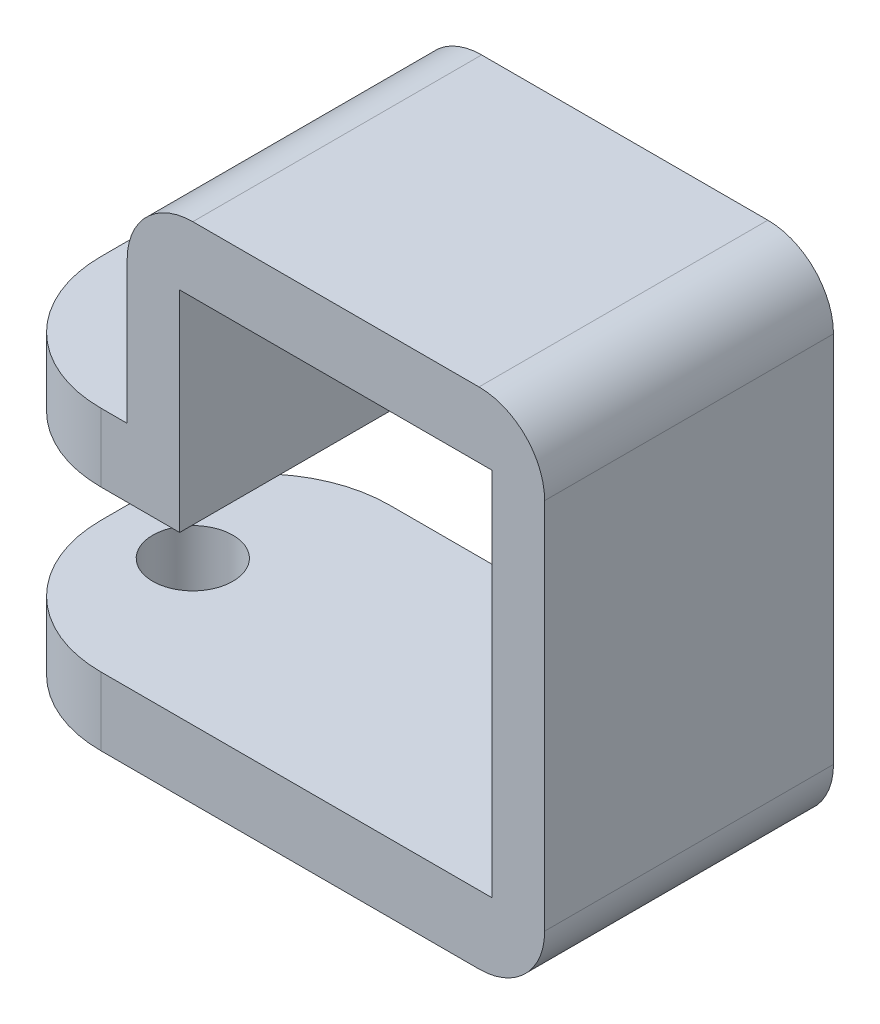
ISO-10303-21;
HEADER;
FILE_DESCRIPTION(('STEP AP214'),'2;1');
FILE_NAME('part.step','',(''),(''),'','','');
FILE_SCHEMA(('AUTOMOTIVE_DESIGN { 1 0 10303 214 1 1 1 1 }'));
ENDSEC;
DATA;
#1=APPLICATION_CONTEXT('core data for automotive mechanical design processes');
#2=APPLICATION_PROTOCOL_DEFINITION('international standard','automotive_design',2000,#1);
#3=PRODUCT_CONTEXT('',#1,'mechanical');
#4=PRODUCT('Part','Part','',(#3));
#5=PRODUCT_RELATED_PRODUCT_CATEGORY('part','',(#4));
#6=PRODUCT_DEFINITION_FORMATION('','',#4);
#7=PRODUCT_DEFINITION_CONTEXT('part definition',#1,'design');
#8=PRODUCT_DEFINITION('design','',#6,#7);
#9=PRODUCT_DEFINITION_SHAPE('','',#8);
#10=(LENGTH_UNIT() NAMED_UNIT(*) SI_UNIT(.MILLI.,.METRE.));
#11=(NAMED_UNIT(*) PLANE_ANGLE_UNIT() SI_UNIT($,.RADIAN.));
#12=(NAMED_UNIT(*) SI_UNIT($,.STERADIAN.) SOLID_ANGLE_UNIT());
#13=UNCERTAINTY_MEASURE_WITH_UNIT(LENGTH_MEASURE(1.E-05),#10,'distance_accuracy_value','');
#14=(GEOMETRIC_REPRESENTATION_CONTEXT(3) GLOBAL_UNCERTAINTY_ASSIGNED_CONTEXT((#13)) GLOBAL_UNIT_ASSIGNED_CONTEXT((#10,
#11,#12)) REPRESENTATION_CONTEXT('',''));
#15=CARTESIAN_POINT('',(0.,0.,0.));
#16=DIRECTION('',(0.,0.,1.));
#17=DIRECTION('',(1.,0.,0.));
#18=AXIS2_PLACEMENT_3D('',#15,#16,#17);
#19=CARTESIAN_POINT('',(-5.95,0.,11.));
#20=DIRECTION('',(-1.,0.,0.));
#21=DIRECTION('',(0.,0.,1.));
#22=AXIS2_PLACEMENT_3D('',#19,#20,#21);
#23=PLANE('',#22);
#24=DIRECTION('',(0.,1.,0.));
#25=VECTOR('',#24,1.);
#26=CARTESIAN_POINT('',(-5.95,0.,0.));
#27=LINE('',#26,#25);
#28=CARTESIAN_POINT('',(-5.95,0.,0.));
#29=VERTEX_POINT('',#28);
#30=CARTESIAN_POINT('',(-5.95,8.,0.));
#31=VERTEX_POINT('',#30);
#32=EDGE_CURVE('E297',#29,#31,#27,.T.);
#33=ORIENTED_EDGE('',*,*,#32,.T.);
#34=DIRECTION('',(0.,0.,-1.));
#35=VECTOR('',#34,1.);
#36=CARTESIAN_POINT('',(-5.95,8.,11.));
#37=LINE('',#36,#35);
#38=CARTESIAN_POINT('',(-5.95,8.,11.));
#39=VERTEX_POINT('',#38);
#40=EDGE_CURVE('E190',#39,#31,#37,.T.);
#41=ORIENTED_EDGE('',*,*,#40,.F.);
#42=DIRECTION('',(0.,1.,0.));
#43=VECTOR('',#42,1.);
#44=CARTESIAN_POINT('',(-5.95,0.,11.));
#45=LINE('',#44,#43);
#46=CARTESIAN_POINT('',(-5.95,0.,11.));
#47=VERTEX_POINT('',#46);
#48=EDGE_CURVE('E172',#47,#39,#45,.T.);
#49=ORIENTED_EDGE('',*,*,#48,.F.);
#50=DIRECTION('',(0.,0.,-1.));
#51=VECTOR('',#50,1.);
#52=CARTESIAN_POINT('',(-5.95,0.,11.));
#53=LINE('',#52,#51);
#54=EDGE_CURVE('E184',#47,#29,#53,.T.);
#55=ORIENTED_EDGE('',*,*,#54,.T.);
#56=EDGE_LOOP('',(#33,#41,#49,#55));
#57=FACE_BOUND('',#56,.T.);
#58=ADVANCED_FACE('F39',(#57),#23,.F.);
#59=CARTESIAN_POINT('',(-5.95,8.,11.));
#60=DIRECTION('',(0.,1.,0.));
#61=DIRECTION('',(0.,0.,1.));
#62=AXIS2_PLACEMENT_3D('',#59,#60,#61);
#63=PLANE('',#62);
#64=DIRECTION('',(1.,0.,0.));
#65=VECTOR('',#64,1.);
#66=CARTESIAN_POINT('',(-5.95,8.,0.));
#67=LINE('',#66,#65);
#68=CARTESIAN_POINT('',(5.95,8.,0.));
#69=VERTEX_POINT('',#68);
#70=EDGE_CURVE('E296',#31,#69,#67,.T.);
#71=ORIENTED_EDGE('',*,*,#70,.T.);
#72=DIRECTION('',(0.,0.,-1.));
#73=VECTOR('',#72,1.);
#74=CARTESIAN_POINT('',(5.95,8.,11.));
#75=LINE('',#74,#73);
#76=CARTESIAN_POINT('',(5.95,8.,11.));
#77=VERTEX_POINT('',#76);
#78=EDGE_CURVE('E196',#77,#69,#75,.T.);
#79=ORIENTED_EDGE('',*,*,#78,.F.);
#80=DIRECTION('',(1.,0.,0.));
#81=VECTOR('',#80,1.);
#82=CARTESIAN_POINT('',(-5.95,8.,11.));
#83=LINE('',#82,#81);
#84=EDGE_CURVE('E186',#39,#77,#83,.T.);
#85=ORIENTED_EDGE('',*,*,#84,.F.);
#86=ORIENTED_EDGE('',*,*,#40,.T.);
#87=EDGE_LOOP('',(#71,#79,#85,#86));
#88=FACE_BOUND('',#87,.T.);
#89=ADVANCED_FACE('F298',(#88),#63,.F.);
#90=CARTESIAN_POINT('',(5.95,0.,11.));
#91=DIRECTION('',(1.,0.,0.));
#92=DIRECTION('',(0.,1.,0.));
#93=AXIS2_PLACEMENT_3D('',#90,#91,#92);
#94=PLANE('',#93);
#95=DIRECTION('',(0.,-1.,0.));
#96=VECTOR('',#95,1.);
#97=CARTESIAN_POINT('',(5.95,0.,0.));
#98=LINE('',#97,#96);
#99=CARTESIAN_POINT('',(5.95,-6.09999999999999,0.));
#100=VERTEX_POINT('',#99);
#101=EDGE_CURVE('E292',#69,#100,#98,.T.);
#102=ORIENTED_EDGE('',*,*,#101,.T.);
#103=DIRECTION('',(0.,0.,-1.));
#104=VECTOR('',#103,1.);
#105=CARTESIAN_POINT('',(5.95,-6.09999999999999,11.));
#106=LINE('',#105,#104);
#107=CARTESIAN_POINT('',(5.95,-6.09999999999999,11.));
#108=VERTEX_POINT('',#107);
#109=EDGE_CURVE('E284',#108,#100,#106,.T.);
#110=ORIENTED_EDGE('',*,*,#109,.F.);
#111=DIRECTION('',(0.,-1.,0.));
#112=VECTOR('',#111,1.);
#113=CARTESIAN_POINT('',(5.95,0.,11.));
#114=LINE('',#113,#112);
#115=EDGE_CURVE('E291',#77,#108,#114,.T.);
#116=ORIENTED_EDGE('',*,*,#115,.F.);
#117=ORIENTED_EDGE('',*,*,#78,.T.);
#118=EDGE_LOOP('',(#102,#110,#116,#117));
#119=FACE_BOUND('',#118,.T.);
#120=ADVANCED_FACE('F287',(#119),#94,.F.);
#121=CARTESIAN_POINT('',(5.95,-6.09999999999999,11.));
#122=DIRECTION('',(0.,-1.,0.));
#123=DIRECTION('',(0.,0.,-1.));
#124=AXIS2_PLACEMENT_3D('',#121,#122,#123);
#125=PLANE('',#124);
#126=CARTESIAN_POINT('',(-10.95,-6.09999999999999,5.5));
#127=DIRECTION('',(0.,-1.,0.));
#128=DIRECTION('',(0.,0.,-1.));
#129=AXIS2_PLACEMENT_3D('',#126,#127,#128);
#130=CIRCLE('',#129,1.525);
#131=CARTESIAN_POINT('',(-10.95,-6.09999999999999,3.975));
#132=VERTEX_POINT('',#131);
#133=EDGE_CURVE('E235',#132,#132,#130,.T.);
#134=ORIENTED_EDGE('',*,*,#133,.T.);
#135=EDGE_LOOP('',(#134));
#136=FACE_BOUND('',#135,.T.);
#137=DIRECTION('',(-1.,0.,0.));
#138=VECTOR('',#137,1.);
#139=CARTESIAN_POINT('',(5.95,-6.09999999999999,0.));
#140=LINE('',#139,#138);
#141=CARTESIAN_POINT('',(-8.95,-6.09999999999999,0.));
#142=VERTEX_POINT('',#141);
#143=EDGE_CURVE('E305',#100,#142,#140,.T.);
#144=ORIENTED_EDGE('',*,*,#143,.T.);
#145=CARTESIAN_POINT('',(-8.95,-6.09999999999999,5.));
#146=DIRECTION('',(0.,-1.,0.));
#147=DIRECTION('',(0.,0.,-1.));
#148=AXIS2_PLACEMENT_3D('',#145,#146,#147);
#149=CIRCLE('',#148,5.);
#150=CARTESIAN_POINT('',(-13.95,-6.09999999999999,5.));
#151=VERTEX_POINT('',#150);
#152=EDGE_CURVE('E247',#142,#151,#149,.F.);
#153=ORIENTED_EDGE('',*,*,#152,.T.);
#154=DIRECTION('',(0.,0.,-1.));
#155=VECTOR('',#154,1.);
#156=CARTESIAN_POINT('',(-13.95,-6.09999999999999,11.));
#157=LINE('',#156,#155);
#158=CARTESIAN_POINT('',(-13.95,-6.09999999999999,6.));
#159=VERTEX_POINT('',#158);
#160=EDGE_CURVE('E283',#159,#151,#157,.T.);
#161=ORIENTED_EDGE('',*,*,#160,.F.);
#162=CARTESIAN_POINT('',(-8.95,-6.09999999999999,6.));
#163=DIRECTION('',(0.,-1.,0.));
#164=DIRECTION('',(0.,0.,-1.));
#165=AXIS2_PLACEMENT_3D('',#162,#163,#164);
#166=CIRCLE('',#165,5.);
#167=CARTESIAN_POINT('',(-8.95,-6.09999999999999,11.));
#168=VERTEX_POINT('',#167);
#169=EDGE_CURVE('E246',#159,#168,#166,.F.);
#170=ORIENTED_EDGE('',*,*,#169,.T.);
#171=DIRECTION('',(-1.,0.,0.));
#172=VECTOR('',#171,1.);
#173=CARTESIAN_POINT('',(5.95,-6.09999999999999,11.));
#174=LINE('',#173,#172);
#175=EDGE_CURVE('E413',#108,#168,#174,.T.);
#176=ORIENTED_EDGE('',*,*,#175,.F.);
#177=ORIENTED_EDGE('',*,*,#109,.T.);
#178=EDGE_LOOP('',(#144,#153,#161,#170,#176,#177));
#179=FACE_BOUND('',#178,.T.);
#180=ADVANCED_FACE('F409',(#136,#179),#125,.F.);
#181=CARTESIAN_POINT('',(-13.95,-6.09999999999999,11.));
#182=DIRECTION('',(1.,0.,0.));
#183=DIRECTION('',(0.,0.,-1.));
#184=AXIS2_PLACEMENT_3D('',#181,#182,#183);
#185=PLANE('',#184);
#186=ORIENTED_EDGE('',*,*,#160,.T.);
#187=DIRECTION('',(0.,-1.,0.));
#188=VECTOR('',#187,1.);
#189=CARTESIAN_POINT('',(-13.95,-6.09999999999999,5.));
#190=LINE('',#189,#188);
#191=CARTESIAN_POINT('',(-13.95,-8.69999999999999,5.));
#192=VERTEX_POINT('',#191);
#193=EDGE_CURVE('E232',#151,#192,#190,.T.);
#194=ORIENTED_EDGE('',*,*,#193,.T.);
#195=DIRECTION('',(0.,0.,-1.));
#196=VECTOR('',#195,1.);
#197=CARTESIAN_POINT('',(-13.95,-8.69999999999999,11.));
#198=LINE('',#197,#196);
#199=CARTESIAN_POINT('',(-13.95,-8.69999999999999,6.));
#200=VERTEX_POINT('',#199);
#201=EDGE_CURVE('E279',#200,#192,#198,.T.);
#202=ORIENTED_EDGE('',*,*,#201,.F.);
#203=DIRECTION('',(0.,-1.,0.));
#204=VECTOR('',#203,1.);
#205=CARTESIAN_POINT('',(-13.95,-6.09999999999999,6.));
#206=LINE('',#205,#204);
#207=EDGE_CURVE('E226',#200,#159,#206,.F.);
#208=ORIENTED_EDGE('',*,*,#207,.T.);
#209=EDGE_LOOP('',(#186,#194,#202,#208));
#210=FACE_BOUND('',#209,.T.);
#211=ADVANCED_FACE('F401',(#210),#185,.F.);
#212=CARTESIAN_POINT('',(-13.95,-8.69999999999999,11.));
#213=DIRECTION('',(0.,1.,0.));
#214=DIRECTION('',(0.,0.,1.));
#215=AXIS2_PLACEMENT_3D('',#212,#213,#214);
#216=PLANE('',#215);
#217=CARTESIAN_POINT('',(-10.95,-8.7,5.5));
#218=DIRECTION('',(0.,1.,0.));
#219=DIRECTION('',(-1.,0.,0.));
#220=AXIS2_PLACEMENT_3D('',#217,#218,#219);
#221=CIRCLE('',#220,1.525);
#222=CARTESIAN_POINT('',(-12.475,-8.7,5.5));
#223=VERTEX_POINT('',#222);
#224=EDGE_CURVE('E231',#223,#223,#221,.T.);
#225=ORIENTED_EDGE('',*,*,#224,.T.);
#226=EDGE_LOOP('',(#225));
#227=FACE_BOUND('',#226,.T.);
#228=ORIENTED_EDGE('',*,*,#201,.T.);
#229=CARTESIAN_POINT('',(-8.95,-8.69999999999999,5.));
#230=DIRECTION('',(0.,1.,0.));
#231=DIRECTION('',(0.,0.,1.));
#232=AXIS2_PLACEMENT_3D('',#229,#230,#231);
#233=CIRCLE('',#232,5.);
#234=CARTESIAN_POINT('',(-8.95,-8.69999999999999,0.));
#235=VERTEX_POINT('',#234);
#236=EDGE_CURVE('E239',#192,#235,#233,.F.);
#237=ORIENTED_EDGE('',*,*,#236,.T.);
#238=DIRECTION('',(1.,0.,0.));
#239=VECTOR('',#238,1.);
#240=CARTESIAN_POINT('',(-13.95,-8.69999999999999,0.));
#241=LINE('',#240,#239);
#242=CARTESIAN_POINT('',(5.45,-8.69999999999999,0.));
#243=VERTEX_POINT('',#242);
#244=EDGE_CURVE('E308',#235,#243,#241,.T.);
#245=ORIENTED_EDGE('',*,*,#244,.T.);
#246=DIRECTION('',(0.,0.,-1.));
#247=VECTOR('',#246,1.);
#248=CARTESIAN_POINT('',(5.45,-8.69999999999999,11.));
#249=LINE('',#248,#247);
#250=CARTESIAN_POINT('',(5.45,-8.69999999999999,11.));
#251=VERTEX_POINT('',#250);
#252=EDGE_CURVE('E212',#243,#251,#249,.F.);
#253=ORIENTED_EDGE('',*,*,#252,.T.);
#254=DIRECTION('',(1.,0.,0.));
#255=VECTOR('',#254,1.);
#256=CARTESIAN_POINT('',(-13.95,-8.69999999999999,11.));
#257=LINE('',#256,#255);
#258=CARTESIAN_POINT('',(-8.95,-8.69999999999999,11.));
#259=VERTEX_POINT('',#258);
#260=EDGE_CURVE('E400',#259,#251,#257,.T.);
#261=ORIENTED_EDGE('',*,*,#260,.F.);
#262=CARTESIAN_POINT('',(-8.95,-8.69999999999999,6.));
#263=DIRECTION('',(0.,1.,0.));
#264=DIRECTION('',(0.,0.,1.));
#265=AXIS2_PLACEMENT_3D('',#262,#263,#264);
#266=CIRCLE('',#265,5.);
#267=EDGE_CURVE('E238',#259,#200,#266,.F.);
#268=ORIENTED_EDGE('',*,*,#267,.T.);
#269=EDGE_LOOP('',(#228,#237,#245,#253,#261,#268));
#270=FACE_BOUND('',#269,.T.);
#271=ADVANCED_FACE('F396',(#227,#270),#216,.F.);
#272=CARTESIAN_POINT('',(7.95,10.5,11.));
#273=DIRECTION('',(-1.,0.,0.));
#274=DIRECTION('',(0.,-1.,0.));
#275=AXIS2_PLACEMENT_3D('',#272,#273,#274);
#276=PLANE('',#275);
#277=DIRECTION('',(0.,1.,0.));
#278=VECTOR('',#277,1.);
#279=CARTESIAN_POINT('',(7.95,-8.69999999999999,11.));
#280=LINE('',#279,#278);
#281=CARTESIAN_POINT('',(7.95,-6.19999999999999,11.));
#282=VERTEX_POINT('',#281);
#283=CARTESIAN_POINT('',(7.95,8.,11.));
#284=VERTEX_POINT('',#283);
#285=EDGE_CURVE('E395',#282,#284,#280,.T.);
#286=ORIENTED_EDGE('',*,*,#285,.F.);
#287=DIRECTION('',(0.,0.,-1.));
#288=VECTOR('',#287,1.);
#289=CARTESIAN_POINT('',(7.95,-6.19999999999999,11.));
#290=LINE('',#289,#288);
#291=CARTESIAN_POINT('',(7.95,-6.19999999999999,0.));
#292=VERTEX_POINT('',#291);
#293=EDGE_CURVE('E198',#282,#292,#290,.T.);
#294=ORIENTED_EDGE('',*,*,#293,.T.);
#295=DIRECTION('',(0.,1.,0.));
#296=VECTOR('',#295,1.);
#297=CARTESIAN_POINT('',(7.95,10.5,0.));
#298=LINE('',#297,#296);
#299=CARTESIAN_POINT('',(7.95,8.,0.));
#300=VERTEX_POINT('',#299);
#301=EDGE_CURVE('E309',#292,#300,#298,.T.);
#302=ORIENTED_EDGE('',*,*,#301,.T.);
#303=DIRECTION('',(0.,0.,-1.));
#304=VECTOR('',#303,1.);
#305=CARTESIAN_POINT('',(7.95,8.,11.));
#306=LINE('',#305,#304);
#307=EDGE_CURVE('E191',#300,#284,#306,.F.);
#308=ORIENTED_EDGE('',*,*,#307,.T.);
#309=EDGE_LOOP('',(#286,#294,#302,#308));
#310=FACE_BOUND('',#309,.T.);
#311=ADVANCED_FACE('F386',(#310),#276,.F.);
#312=CARTESIAN_POINT('',(7.95,10.5,11.));
#313=DIRECTION('',(0.,-1.,0.));
#314=DIRECTION('',(0.,0.,-1.));
#315=AXIS2_PLACEMENT_3D('',#312,#313,#314);
#316=PLANE('',#315);
#317=DIRECTION('',(-1.,0.,0.));
#318=VECTOR('',#317,1.);
#319=CARTESIAN_POINT('',(7.95,10.5,11.));
#320=LINE('',#319,#318);
#321=CARTESIAN_POINT('',(5.45,10.5,11.));
#322=VERTEX_POINT('',#321);
#323=CARTESIAN_POINT('',(-5.45,10.5,11.));
#324=VERTEX_POINT('',#323);
#325=EDGE_CURVE('E374',#322,#324,#320,.T.);
#326=ORIENTED_EDGE('',*,*,#325,.F.);
#327=DIRECTION('',(0.,0.,-1.));
#328=VECTOR('',#327,1.);
#329=CARTESIAN_POINT('',(5.45,10.5,11.));
#330=LINE('',#329,#328);
#331=CARTESIAN_POINT('',(5.45,10.5,0.));
#332=VERTEX_POINT('',#331);
#333=EDGE_CURVE('E221',#322,#332,#330,.T.);
#334=ORIENTED_EDGE('',*,*,#333,.T.);
#335=DIRECTION('',(-1.,0.,0.));
#336=VECTOR('',#335,1.);
#337=CARTESIAN_POINT('',(7.95,10.5,0.));
#338=LINE('',#337,#336);
#339=CARTESIAN_POINT('',(-5.45,10.5,0.));
#340=VERTEX_POINT('',#339);
#341=EDGE_CURVE('E312',#332,#340,#338,.T.);
#342=ORIENTED_EDGE('',*,*,#341,.T.);
#343=DIRECTION('',(0.,0.,-1.));
#344=VECTOR('',#343,1.);
#345=CARTESIAN_POINT('',(-5.45,10.5,11.));
#346=LINE('',#345,#344);
#347=EDGE_CURVE('E217',#340,#324,#346,.F.);
#348=ORIENTED_EDGE('',*,*,#347,.T.);
#349=EDGE_LOOP('',(#326,#334,#342,#348));
#350=FACE_BOUND('',#349,.T.);
#351=ADVANCED_FACE('F385',(#350),#316,.F.);
#352=CARTESIAN_POINT('',(-7.95,10.5,11.));
#353=DIRECTION('',(1.,0.,0.));
#354=DIRECTION('',(0.,1.,0.));
#355=AXIS2_PLACEMENT_3D('',#352,#353,#354);
#356=PLANE('',#355);
#357=DIRECTION('',(0.,-1.,0.));
#358=VECTOR('',#357,1.);
#359=CARTESIAN_POINT('',(-7.95,10.5,11.));
#360=LINE('',#359,#358);
#361=CARTESIAN_POINT('',(-7.95,8.,11.));
#362=VERTEX_POINT('',#361);
#363=CARTESIAN_POINT('',(-7.95,2.6,11.));
#364=VERTEX_POINT('',#363);
#365=EDGE_CURVE('E272',#362,#364,#360,.T.);
#366=ORIENTED_EDGE('',*,*,#365,.F.);
#367=DIRECTION('',(0.,0.,-1.));
#368=VECTOR('',#367,1.);
#369=CARTESIAN_POINT('',(-7.95,8.,11.));
#370=LINE('',#369,#368);
#371=CARTESIAN_POINT('',(-7.95,8.,0.));
#372=VERTEX_POINT('',#371);
#373=EDGE_CURVE('E222',#362,#372,#370,.T.);
#374=ORIENTED_EDGE('',*,*,#373,.T.);
#375=DIRECTION('',(0.,-1.,0.));
#376=VECTOR('',#375,1.);
#377=CARTESIAN_POINT('',(-7.95,10.5,0.));
#378=LINE('',#377,#376);
#379=CARTESIAN_POINT('',(-7.95,2.6,0.));
#380=VERTEX_POINT('',#379);
#381=EDGE_CURVE('E317',#372,#380,#378,.T.);
#382=ORIENTED_EDGE('',*,*,#381,.T.);
#383=DIRECTION('',(0.,0.,-1.));
#384=VECTOR('',#383,1.);
#385=CARTESIAN_POINT('',(-7.95,2.6,11.));
#386=LINE('',#385,#384);
#387=EDGE_CURVE('E268',#364,#380,#386,.T.);
#388=ORIENTED_EDGE('',*,*,#387,.F.);
#389=EDGE_LOOP('',(#366,#374,#382,#388));
#390=FACE_BOUND('',#389,.T.);
#391=ADVANCED_FACE('F380',(#390),#356,.F.);
#392=CARTESIAN_POINT('',(-7.95,2.6,11.));
#393=DIRECTION('',(0.,-1.,0.));
#394=DIRECTION('',(1.,0.,0.));
#395=AXIS2_PLACEMENT_3D('',#392,#393,#394);
#396=PLANE('',#395);
#397=CARTESIAN_POINT('',(-10.95,2.6,5.5));
#398=DIRECTION('',(0.,1.,0.));
#399=DIRECTION('',(-1.,0.,0.));
#400=AXIS2_PLACEMENT_3D('',#397,#398,#399);
#401=CIRCLE('',#400,1.525);
#402=CARTESIAN_POINT('',(-12.475,2.6,5.5));
#403=VERTEX_POINT('',#402);
#404=EDGE_CURVE('E423',#403,#403,#401,.T.);
#405=ORIENTED_EDGE('',*,*,#404,.F.);
#406=EDGE_LOOP('',(#405));
#407=FACE_BOUND('',#406,.T.);
#408=DIRECTION('',(0.,0.,-1.));
#409=VECTOR('',#408,1.);
#410=CARTESIAN_POINT('',(-13.95,2.6,11.));
#411=LINE('',#410,#409);
#412=CARTESIAN_POINT('',(-13.95,2.6,6.));
#413=VERTEX_POINT('',#412);
#414=CARTESIAN_POINT('',(-13.95,2.6,5.));
#415=VERTEX_POINT('',#414);
#416=EDGE_CURVE('E262',#413,#415,#411,.T.);
#417=ORIENTED_EDGE('',*,*,#416,.F.);
#418=CARTESIAN_POINT('',(-8.95,2.6,6.));
#419=DIRECTION('',(0.,-1.,0.));
#420=DIRECTION('',(1.,0.,0.));
#421=AXIS2_PLACEMENT_3D('',#418,#419,#420);
#422=CIRCLE('',#421,5.);
#423=CARTESIAN_POINT('',(-8.95,2.6,11.));
#424=VERTEX_POINT('',#423);
#425=EDGE_CURVE('E11',#413,#424,#422,.F.);
#426=ORIENTED_EDGE('',*,*,#425,.T.);
#427=DIRECTION('',(-1.,0.,0.));
#428=VECTOR('',#427,1.);
#429=CARTESIAN_POINT('',(-7.95,2.6,11.));
#430=LINE('',#429,#428);
#431=EDGE_CURVE('E266',#364,#424,#430,.T.);
#432=ORIENTED_EDGE('',*,*,#431,.F.);
#433=ORIENTED_EDGE('',*,*,#387,.T.);
#434=DIRECTION('',(-1.,0.,0.));
#435=VECTOR('',#434,1.);
#436=CARTESIAN_POINT('',(-7.95,2.6,0.));
#437=LINE('',#436,#435);
#438=CARTESIAN_POINT('',(-8.95,2.6,0.));
#439=VERTEX_POINT('',#438);
#440=EDGE_CURVE('E320',#380,#439,#437,.T.);
#441=ORIENTED_EDGE('',*,*,#440,.T.);
#442=CARTESIAN_POINT('',(-8.95,2.6,5.));
#443=DIRECTION('',(0.,-1.,0.));
#444=DIRECTION('',(1.,0.,0.));
#445=AXIS2_PLACEMENT_3D('',#442,#443,#444);
#446=CIRCLE('',#445,5.);
#447=EDGE_CURVE('E50',#439,#415,#446,.F.);
#448=ORIENTED_EDGE('',*,*,#447,.T.);
#449=EDGE_LOOP('',(#417,#426,#432,#433,#441,#448));
#450=FACE_BOUND('',#449,.T.);
#451=ADVANCED_FACE('F316',(#407,#450),#396,.F.);
#452=CARTESIAN_POINT('',(-13.95,0.,11.));
#453=DIRECTION('',(1.,0.,0.));
#454=DIRECTION('',(0.,0.,-1.));
#455=AXIS2_PLACEMENT_3D('',#452,#453,#454);
#456=PLANE('',#455);
#457=DIRECTION('',(0.,0.,-1.));
#458=VECTOR('',#457,1.);
#459=CARTESIAN_POINT('',(-13.95,0.,11.));
#460=LINE('',#459,#458);
#461=CARTESIAN_POINT('',(-13.95,0.,6.));
#462=VERTEX_POINT('',#461);
#463=CARTESIAN_POINT('',(-13.95,0.,5.));
#464=VERTEX_POINT('',#463);
#465=EDGE_CURVE('E264',#462,#464,#460,.T.);
#466=ORIENTED_EDGE('',*,*,#465,.F.);
#467=DIRECTION('',(0.,-1.,0.));
#468=VECTOR('',#467,1.);
#469=CARTESIAN_POINT('',(-13.95,2.6,6.));
#470=LINE('',#469,#468);
#471=EDGE_CURVE('E58',#462,#413,#470,.F.);
#472=ORIENTED_EDGE('',*,*,#471,.T.);
#473=ORIENTED_EDGE('',*,*,#416,.T.);
#474=DIRECTION('',(0.,-1.,0.));
#475=VECTOR('',#474,1.);
#476=CARTESIAN_POINT('',(-13.95,0.,5.));
#477=LINE('',#476,#475);
#478=EDGE_CURVE('E259',#415,#464,#477,.T.);
#479=ORIENTED_EDGE('',*,*,#478,.T.);
#480=EDGE_LOOP('',(#466,#472,#473,#479));
#481=FACE_BOUND('',#480,.T.);
#482=ADVANCED_FACE('F261',(#481),#456,.F.);
#483=CARTESIAN_POINT('',(-8.65875,0.,11.));
#484=DIRECTION('',(0.,1.,0.));
#485=DIRECTION('',(-1.,0.,0.));
#486=AXIS2_PLACEMENT_3D('',#483,#484,#485);
#487=PLANE('',#486);
#488=CARTESIAN_POINT('',(-10.95,0.,5.5));
#489=DIRECTION('',(0.,1.,0.));
#490=DIRECTION('',(-1.,0.,0.));
#491=AXIS2_PLACEMENT_3D('',#488,#489,#490);
#492=CIRCLE('',#491,1.525);
#493=CARTESIAN_POINT('',(-12.475,0.,5.5));
#494=VERTEX_POINT('',#493);
#495=EDGE_CURVE('E230',#494,#494,#492,.T.);
#496=ORIENTED_EDGE('',*,*,#495,.T.);
#497=EDGE_LOOP('',(#496));
#498=FACE_BOUND('',#497,.T.);
#499=DIRECTION('',(1.,0.,0.));
#500=VECTOR('',#499,1.);
#501=CARTESIAN_POINT('',(-8.65875,0.,11.));
#502=LINE('',#501,#500);
#503=CARTESIAN_POINT('',(-8.95,0.,11.));
#504=VERTEX_POINT('',#503);
#505=EDGE_CURVE('E167',#504,#47,#502,.T.);
#506=ORIENTED_EDGE('',*,*,#505,.F.);
#507=CARTESIAN_POINT('',(-8.95,0.,6.));
#508=DIRECTION('',(0.,1.,0.));
#509=DIRECTION('',(-1.,0.,0.));
#510=AXIS2_PLACEMENT_3D('',#507,#508,#509);
#511=CIRCLE('',#510,5.);
#512=EDGE_CURVE('E257',#504,#462,#511,.F.);
#513=ORIENTED_EDGE('',*,*,#512,.T.);
#514=ORIENTED_EDGE('',*,*,#465,.T.);
#515=CARTESIAN_POINT('',(-8.95,0.,5.));
#516=DIRECTION('',(0.,1.,0.));
#517=DIRECTION('',(-1.,0.,0.));
#518=AXIS2_PLACEMENT_3D('',#515,#516,#517);
#519=CIRCLE('',#518,5.);
#520=CARTESIAN_POINT('',(-8.95,0.,0.));
#521=VERTEX_POINT('',#520);
#522=EDGE_CURVE('E251',#464,#521,#519,.F.);
#523=ORIENTED_EDGE('',*,*,#522,.T.);
#524=DIRECTION('',(1.,0.,0.));
#525=VECTOR('',#524,1.);
#526=CARTESIAN_POINT('',(-8.65875,0.,0.));
#527=LINE('',#526,#525);
#528=EDGE_CURVE('E181',#521,#29,#527,.T.);
#529=ORIENTED_EDGE('',*,*,#528,.T.);
#530=ORIENTED_EDGE('',*,*,#54,.F.);
#531=EDGE_LOOP('',(#506,#513,#514,#523,#529,#530));
#532=FACE_BOUND('',#531,.T.);
#533=ADVANCED_FACE('F192',(#498,#532),#487,.F.);
#534=CARTESIAN_POINT('',(0.,0.,11.));
#535=DIRECTION('',(0.,0.,1.));
#536=DIRECTION('',(1.,0.,0.));
#537=AXIS2_PLACEMENT_3D('',#534,#535,#536);
#538=PLANE('',#537);
#539=ORIENTED_EDGE('',*,*,#175,.T.);
#540=DIRECTION('',(0.,-1.,0.));
#541=VECTOR('',#540,1.);
#542=CARTESIAN_POINT('',(-8.95,-8.69999999999999,11.));
#543=LINE('',#542,#541);
#544=EDGE_CURVE('E252',#168,#259,#543,.T.);
#545=ORIENTED_EDGE('',*,*,#544,.T.);
#546=ORIENTED_EDGE('',*,*,#260,.T.);
#547=CARTESIAN_POINT('',(5.45,-6.19999999999999,11.));
#548=DIRECTION('',(0.,0.,1.));
#549=DIRECTION('',(1.,0.,0.));
#550=AXIS2_PLACEMENT_3D('',#547,#548,#549);
#551=CIRCLE('',#550,2.5);
#552=EDGE_CURVE('E216',#251,#282,#551,.T.);
#553=ORIENTED_EDGE('',*,*,#552,.T.);
#554=ORIENTED_EDGE('',*,*,#285,.T.);
#555=CARTESIAN_POINT('',(5.45,8.,11.));
#556=DIRECTION('',(0.,0.,1.));
#557=DIRECTION('',(1.,0.,0.));
#558=AXIS2_PLACEMENT_3D('',#555,#556,#557);
#559=CIRCLE('',#558,2.5);
#560=EDGE_CURVE('E218',#284,#322,#559,.T.);
#561=ORIENTED_EDGE('',*,*,#560,.T.);
#562=ORIENTED_EDGE('',*,*,#325,.T.);
#563=CARTESIAN_POINT('',(-5.45,8.,11.));
#564=DIRECTION('',(0.,0.,1.));
#565=DIRECTION('',(1.,0.,0.));
#566=AXIS2_PLACEMENT_3D('',#563,#564,#565);
#567=CIRCLE('',#566,2.5);
#568=EDGE_CURVE('E211',#324,#362,#567,.T.);
#569=ORIENTED_EDGE('',*,*,#568,.T.);
#570=ORIENTED_EDGE('',*,*,#365,.T.);
#571=ORIENTED_EDGE('',*,*,#431,.T.);
#572=DIRECTION('',(0.,-1.,0.));
#573=VECTOR('',#572,1.);
#574=CARTESIAN_POINT('',(-8.95,0.,11.));
#575=LINE('',#574,#573);
#576=EDGE_CURVE('E178',#424,#504,#575,.T.);
#577=ORIENTED_EDGE('',*,*,#576,.T.);
#578=ORIENTED_EDGE('',*,*,#505,.T.);
#579=ORIENTED_EDGE('',*,*,#48,.T.);
#580=ORIENTED_EDGE('',*,*,#84,.T.);
#581=ORIENTED_EDGE('',*,*,#115,.T.);
#582=EDGE_LOOP('',(#539,#545,#546,#553,#554,#561,#562,#569,#570,#571,#577,#578,#579,#580,#581));
#583=FACE_BOUND('',#582,.T.);
#584=ADVANCED_FACE('F173',(#583),#538,.T.);
#585=CARTESIAN_POINT('',(0.,0.,0.));
#586=DIRECTION('',(0.,0.,1.));
#587=DIRECTION('',(1.,0.,0.));
#588=AXIS2_PLACEMENT_3D('',#585,#586,#587);
#589=PLANE('',#588);
#590=ORIENTED_EDGE('',*,*,#244,.F.);
#591=DIRECTION('',(0.,-1.,0.));
#592=VECTOR('',#591,1.);
#593=CARTESIAN_POINT('',(-8.95,0.,0.));
#594=LINE('',#593,#592);
#595=EDGE_CURVE('E242',#235,#142,#594,.F.);
#596=ORIENTED_EDGE('',*,*,#595,.T.);
#597=ORIENTED_EDGE('',*,*,#143,.F.);
#598=ORIENTED_EDGE('',*,*,#101,.F.);
#599=ORIENTED_EDGE('',*,*,#70,.F.);
#600=ORIENTED_EDGE('',*,*,#32,.F.);
#601=ORIENTED_EDGE('',*,*,#528,.F.);
#602=DIRECTION('',(0.,-1.,0.));
#603=VECTOR('',#602,1.);
#604=CARTESIAN_POINT('',(-8.95,0.,0.));
#605=LINE('',#604,#603);
#606=EDGE_CURVE('E245',#521,#439,#605,.F.);
#607=ORIENTED_EDGE('',*,*,#606,.T.);
#608=ORIENTED_EDGE('',*,*,#440,.F.);
#609=ORIENTED_EDGE('',*,*,#381,.F.);
#610=CARTESIAN_POINT('',(-5.45,8.,0.));
#611=DIRECTION('',(0.,0.,1.));
#612=DIRECTION('',(1.,0.,0.));
#613=AXIS2_PLACEMENT_3D('',#610,#611,#612);
#614=CIRCLE('',#613,2.5);
#615=EDGE_CURVE('E203',#372,#340,#614,.F.);
#616=ORIENTED_EDGE('',*,*,#615,.T.);
#617=ORIENTED_EDGE('',*,*,#341,.F.);
#618=CARTESIAN_POINT('',(5.45,8.,0.));
#619=DIRECTION('',(0.,0.,1.));
#620=DIRECTION('',(1.,0.,0.));
#621=AXIS2_PLACEMENT_3D('',#618,#619,#620);
#622=CIRCLE('',#621,2.5);
#623=EDGE_CURVE('E207',#332,#300,#622,.F.);
#624=ORIENTED_EDGE('',*,*,#623,.T.);
#625=ORIENTED_EDGE('',*,*,#301,.F.);
#626=CARTESIAN_POINT('',(5.45,-6.19999999999999,0.));
#627=DIRECTION('',(0.,0.,1.));
#628=DIRECTION('',(1.,0.,0.));
#629=AXIS2_PLACEMENT_3D('',#626,#627,#628);
#630=CIRCLE('',#629,2.5);
#631=EDGE_CURVE('E206',#292,#243,#630,.F.);
#632=ORIENTED_EDGE('',*,*,#631,.T.);
#633=EDGE_LOOP('',(#590,#596,#597,#598,#599,#600,#601,#607,#608,#609,#616,#617,#624,#625,#632));
#634=FACE_BOUND('',#633,.T.);
#635=ADVANCED_FACE('F323',(#634),#589,.F.);
#636=CARTESIAN_POINT('',(5.45,-6.19999999999999,11.));
#637=DIRECTION('',(0.,0.,-1.));
#638=DIRECTION('',(-1.,0.,0.));
#639=AXIS2_PLACEMENT_3D('',#636,#637,#638);
#640=CYLINDRICAL_SURFACE('',#639,2.5);
#641=ORIENTED_EDGE('',*,*,#552,.F.);
#642=ORIENTED_EDGE('',*,*,#252,.F.);
#643=ORIENTED_EDGE('',*,*,#631,.F.);
#644=ORIENTED_EDGE('',*,*,#293,.F.);
#645=EDGE_LOOP('',(#641,#642,#643,#644));
#646=FACE_BOUND('',#645,.T.);
#647=ADVANCED_FACE('F326',(#646),#640,.T.);
#648=CARTESIAN_POINT('',(5.45,8.,11.));
#649=DIRECTION('',(0.,0.,-1.));
#650=DIRECTION('',(-1.,0.,0.));
#651=AXIS2_PLACEMENT_3D('',#648,#649,#650);
#652=CYLINDRICAL_SURFACE('',#651,2.5);
#653=ORIENTED_EDGE('',*,*,#560,.F.);
#654=ORIENTED_EDGE('',*,*,#307,.F.);
#655=ORIENTED_EDGE('',*,*,#623,.F.);
#656=ORIENTED_EDGE('',*,*,#333,.F.);
#657=EDGE_LOOP('',(#653,#654,#655,#656));
#658=FACE_BOUND('',#657,.T.);
#659=ADVANCED_FACE('F332',(#658),#652,.T.);
#660=CARTESIAN_POINT('',(-5.45,8.,11.));
#661=DIRECTION('',(0.,0.,-1.));
#662=DIRECTION('',(-1.,0.,0.));
#663=AXIS2_PLACEMENT_3D('',#660,#661,#662);
#664=CYLINDRICAL_SURFACE('',#663,2.5);
#665=ORIENTED_EDGE('',*,*,#568,.F.);
#666=ORIENTED_EDGE('',*,*,#347,.F.);
#667=ORIENTED_EDGE('',*,*,#615,.F.);
#668=ORIENTED_EDGE('',*,*,#373,.F.);
#669=EDGE_LOOP('',(#665,#666,#667,#668));
#670=FACE_BOUND('',#669,.T.);
#671=ADVANCED_FACE('F347',(#670),#664,.T.);
#672=CARTESIAN_POINT('',(-10.95,-8.7,5.5));
#673=DIRECTION('',(0.,1.,0.));
#674=DIRECTION('',(-1.,0.,0.));
#675=AXIS2_PLACEMENT_3D('',#672,#673,#674);
#676=CYLINDRICAL_SURFACE('',#675,1.525);
#677=ORIENTED_EDGE('',*,*,#404,.T.);
#678=EDGE_LOOP('',(#677));
#679=FACE_BOUND('',#678,.T.);
#680=ORIENTED_EDGE('',*,*,#495,.F.);
#681=EDGE_LOOP('',(#680));
#682=FACE_BOUND('',#681,.T.);
#683=ADVANCED_FACE('F353',(#679,#682),#676,.F.);
#684=ORIENTED_EDGE('',*,*,#224,.F.);
#685=EDGE_LOOP('',(#684));
#686=FACE_BOUND('',#685,.T.);
#687=ORIENTED_EDGE('',*,*,#133,.F.);
#688=EDGE_LOOP('',(#687));
#689=FACE_BOUND('',#688,.T.);
#690=ADVANCED_FACE('F360',(#686,#689),#676,.F.);
#691=CARTESIAN_POINT('',(-8.95,-6.09999999999999,5.));
#692=DIRECTION('',(0.,-1.,0.));
#693=DIRECTION('',(0.,0.,-1.));
#694=AXIS2_PLACEMENT_3D('',#691,#692,#693);
#695=CYLINDRICAL_SURFACE('',#694,5.);
#696=ORIENTED_EDGE('',*,*,#152,.F.);
#697=ORIENTED_EDGE('',*,*,#595,.F.);
#698=ORIENTED_EDGE('',*,*,#236,.F.);
#699=ORIENTED_EDGE('',*,*,#193,.F.);
#700=EDGE_LOOP('',(#696,#697,#698,#699));
#701=FACE_BOUND('',#700,.T.);
#702=ADVANCED_FACE('F358',(#701),#695,.T.);
#703=CARTESIAN_POINT('',(-8.95,0.,6.));
#704=DIRECTION('',(0.,1.,0.));
#705=DIRECTION('',(0.,0.,1.));
#706=AXIS2_PLACEMENT_3D('',#703,#704,#705);
#707=CYLINDRICAL_SURFACE('',#706,5.);
#708=ORIENTED_EDGE('',*,*,#169,.F.);
#709=ORIENTED_EDGE('',*,*,#207,.F.);
#710=ORIENTED_EDGE('',*,*,#267,.F.);
#711=ORIENTED_EDGE('',*,*,#544,.F.);
#712=EDGE_LOOP('',(#708,#709,#710,#711));
#713=FACE_BOUND('',#712,.T.);
#714=ADVANCED_FACE('F356',(#713),#707,.T.);
#715=CARTESIAN_POINT('',(-8.95,0.,6.));
#716=DIRECTION('',(0.,1.,0.));
#717=DIRECTION('',(0.,0.,1.));
#718=AXIS2_PLACEMENT_3D('',#715,#716,#717);
#719=CYLINDRICAL_SURFACE('',#718,5.);
#720=ORIENTED_EDGE('',*,*,#425,.F.);
#721=ORIENTED_EDGE('',*,*,#471,.F.);
#722=ORIENTED_EDGE('',*,*,#512,.F.);
#723=ORIENTED_EDGE('',*,*,#576,.F.);
#724=EDGE_LOOP('',(#720,#721,#722,#723));
#725=FACE_BOUND('',#724,.T.);
#726=ADVANCED_FACE('F365',(#725),#719,.T.);
#727=CARTESIAN_POINT('',(-8.95,0.,5.));
#728=DIRECTION('',(0.,-1.,0.));
#729=DIRECTION('',(0.,0.,-1.));
#730=AXIS2_PLACEMENT_3D('',#727,#728,#729);
#731=CYLINDRICAL_SURFACE('',#730,5.);
#732=ORIENTED_EDGE('',*,*,#447,.F.);
#733=ORIENTED_EDGE('',*,*,#606,.F.);
#734=ORIENTED_EDGE('',*,*,#522,.F.);
#735=ORIENTED_EDGE('',*,*,#478,.F.);
#736=EDGE_LOOP('',(#732,#733,#734,#735));
#737=FACE_BOUND('',#736,.T.);
#738=ADVANCED_FACE('F41',(#737),#731,.T.);
#739=CLOSED_SHELL('',(#58,#89,#120,#180,#211,#271,#311,#351,#391,#451,#482,#533,#584,#635,#647,
#659,#671,#683,#690,#702,#714,#726,#738));
#740=MANIFOLD_SOLID_BREP('B2',#739);
#741=ADVANCED_BREP_SHAPE_REPRESENTATION('',(#18,#740),#14);
#742=SHAPE_DEFINITION_REPRESENTATION(#9,#741);
ENDSEC;
END-ISO-10303-21;
